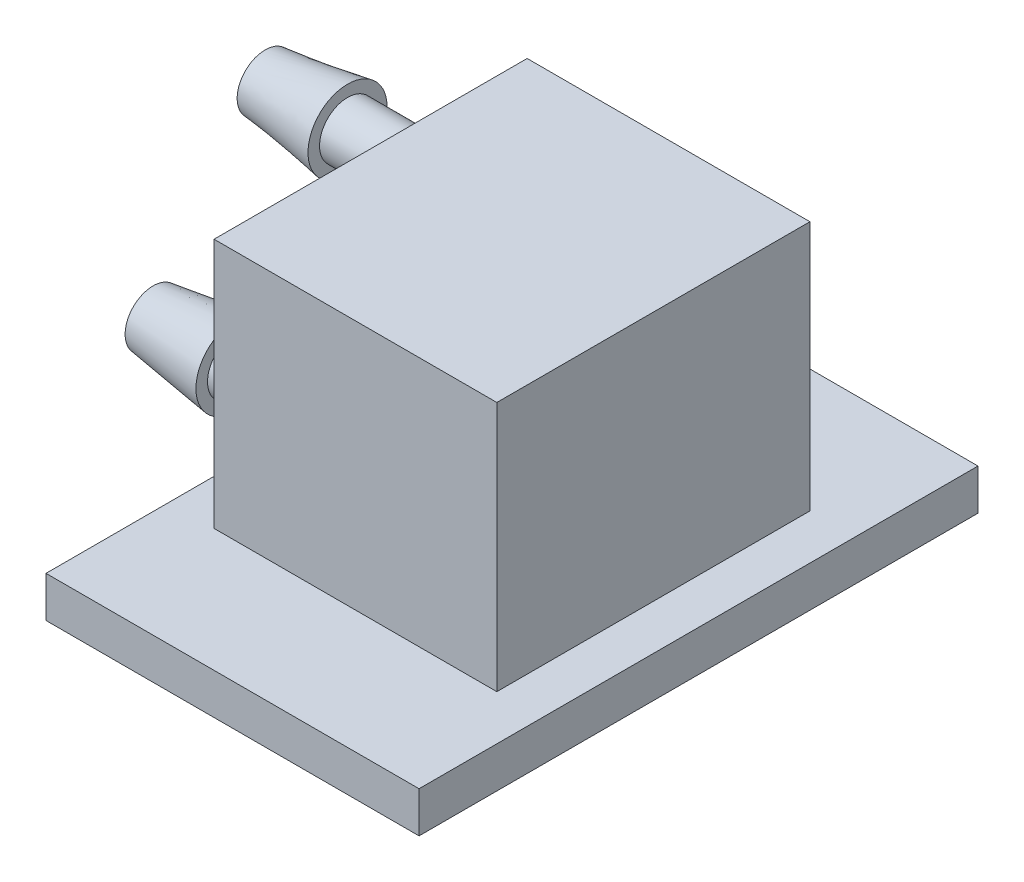
ISO-10303-21;
HEADER;
FILE_DESCRIPTION(('STEP AP214'),'2;1');
FILE_NAME('part.step','',(''),(''),'','','');
FILE_SCHEMA(('AUTOMOTIVE_DESIGN { 1 0 10303 214 1 1 1 1 }'));
ENDSEC;
DATA;
#1=APPLICATION_CONTEXT('core data for automotive mechanical design processes');
#2=APPLICATION_PROTOCOL_DEFINITION('international standard','automotive_design',2000,#1);
#3=PRODUCT_CONTEXT('',#1,'mechanical');
#4=PRODUCT('Part','Part','',(#3));
#5=PRODUCT_RELATED_PRODUCT_CATEGORY('part','',(#4));
#6=PRODUCT_DEFINITION_FORMATION('','',#4);
#7=PRODUCT_DEFINITION_CONTEXT('part definition',#1,'design');
#8=PRODUCT_DEFINITION('design','',#6,#7);
#9=PRODUCT_DEFINITION_SHAPE('','',#8);
#10=(LENGTH_UNIT() NAMED_UNIT(*) SI_UNIT(.MILLI.,.METRE.));
#11=(NAMED_UNIT(*) PLANE_ANGLE_UNIT() SI_UNIT($,.RADIAN.));
#12=(NAMED_UNIT(*) SI_UNIT($,.STERADIAN.) SOLID_ANGLE_UNIT());
#13=UNCERTAINTY_MEASURE_WITH_UNIT(LENGTH_MEASURE(1.E-05),#10,'distance_accuracy_value','');
#14=(GEOMETRIC_REPRESENTATION_CONTEXT(3) GLOBAL_UNCERTAINTY_ASSIGNED_CONTEXT((#13)) GLOBAL_UNIT_ASSIGNED_CONTEXT((#10,
#11,#12)) REPRESENTATION_CONTEXT('',''));
#15=CARTESIAN_POINT('',(0.,0.,0.));
#16=DIRECTION('',(0.,0.,1.));
#17=DIRECTION('',(1.,0.,0.));
#18=AXIS2_PLACEMENT_3D('',#15,#16,#17);
#19=CARTESIAN_POINT('',(0.,9.652,0.));
#20=DIRECTION('',(1.,0.,0.));
#21=DIRECTION('',(0.,0.,-1.));
#22=AXIS2_PLACEMENT_3D('',#19,#20,#21);
#23=PLANE('',#22);
#24=CARTESIAN_POINT('',(0.,7.6835,-8.1915));
#25=DIRECTION('',(1.,0.,0.));
#26=DIRECTION('',(0.,0.,-1.));
#27=AXIS2_PLACEMENT_3D('',#24,#25,#26);
#28=CIRCLE('',#27,1.0795);
#29=CARTESIAN_POINT('',(0.,7.6835,-9.271));
#30=VERTEX_POINT('',#29);
#31=EDGE_CURVE('E47',#30,#30,#28,.F.);
#32=ORIENTED_EDGE('',*,*,#31,.F.);
#33=EDGE_LOOP('',(#32));
#34=FACE_BOUND('',#33,.T.);
#35=DIRECTION('',(0.,0.,1.));
#36=VECTOR('',#35,1.);
#37=CARTESIAN_POINT('',(0.,0.,0.));
#38=LINE('',#37,#36);
#39=CARTESIAN_POINT('',(0.,0.,-12.065));
#40=VERTEX_POINT('',#39);
#41=CARTESIAN_POINT('',(0.,0.,0.));
#42=VERTEX_POINT('',#41);
#43=EDGE_CURVE('E225',#40,#42,#38,.T.);
#44=ORIENTED_EDGE('',*,*,#43,.T.);
#45=DIRECTION('',(0.,-1.,0.));
#46=VECTOR('',#45,1.);
#47=CARTESIAN_POINT('',(0.,9.652,0.));
#48=LINE('',#47,#46);
#49=CARTESIAN_POINT('',(0.,9.652,0.));
#50=VERTEX_POINT('',#49);
#51=EDGE_CURVE('E253',#50,#42,#48,.T.);
#52=ORIENTED_EDGE('',*,*,#51,.F.);
#53=DIRECTION('',(0.,0.,1.));
#54=VECTOR('',#53,1.);
#55=CARTESIAN_POINT('',(0.,9.652,0.));
#56=LINE('',#55,#54);
#57=CARTESIAN_POINT('',(0.,9.652,-12.065));
#58=VERTEX_POINT('',#57);
#59=EDGE_CURVE('E226',#58,#50,#56,.T.);
#60=ORIENTED_EDGE('',*,*,#59,.F.);
#61=DIRECTION('',(0.,-1.,0.));
#62=VECTOR('',#61,1.);
#63=CARTESIAN_POINT('',(0.,9.652,-12.065));
#64=LINE('',#63,#62);
#65=EDGE_CURVE('E234',#58,#40,#64,.T.);
#66=ORIENTED_EDGE('',*,*,#65,.T.);
#67=EDGE_LOOP('',(#44,#52,#60,#66));
#68=FACE_BOUND('',#67,.T.);
#69=CARTESIAN_POINT('',(0.,1.9685,-3.8735));
#70=DIRECTION('',(1.,0.,0.));
#71=DIRECTION('',(0.,0.,-1.));
#72=AXIS2_PLACEMENT_3D('',#69,#70,#71);
#73=CIRCLE('',#72,1.0795);
#74=CARTESIAN_POINT('',(0.,1.9685,-4.953));
#75=VERTEX_POINT('',#74);
#76=EDGE_CURVE('E12',#75,#75,#73,.F.);
#77=ORIENTED_EDGE('',*,*,#76,.F.);
#78=EDGE_LOOP('',(#77));
#79=FACE_BOUND('',#78,.T.);
#80=ADVANCED_FACE('F39',(#34,#68,#79),#23,.F.);
#81=CARTESIAN_POINT('',(0.,9.652,0.));
#82=DIRECTION('',(0.,0.,-1.));
#83=DIRECTION('',(-1.,0.,0.));
#84=AXIS2_PLACEMENT_3D('',#81,#82,#83);
#85=PLANE('',#84);
#86=DIRECTION('',(1.,0.,0.));
#87=VECTOR('',#86,1.);
#88=CARTESIAN_POINT('',(0.,0.,0.));
#89=LINE('',#88,#87);
#90=CARTESIAN_POINT('',(10.8966,0.,0.));
#91=VERTEX_POINT('',#90);
#92=EDGE_CURVE('E237',#42,#91,#89,.T.);
#93=ORIENTED_EDGE('',*,*,#92,.T.);
#94=DIRECTION('',(0.,-1.,0.));
#95=VECTOR('',#94,1.);
#96=CARTESIAN_POINT('',(10.8966,9.652,0.));
#97=LINE('',#96,#95);
#98=CARTESIAN_POINT('',(10.8966,9.652,0.));
#99=VERTEX_POINT('',#98);
#100=EDGE_CURVE('E250',#99,#91,#97,.T.);
#101=ORIENTED_EDGE('',*,*,#100,.F.);
#102=DIRECTION('',(1.,0.,0.));
#103=VECTOR('',#102,1.);
#104=CARTESIAN_POINT('',(0.,9.652,0.));
#105=LINE('',#104,#103);
#106=EDGE_CURVE('E228',#50,#99,#105,.T.);
#107=ORIENTED_EDGE('',*,*,#106,.F.);
#108=ORIENTED_EDGE('',*,*,#51,.T.);
#109=EDGE_LOOP('',(#93,#101,#107,#108));
#110=FACE_BOUND('',#109,.T.);
#111=ADVANCED_FACE('F262',(#110),#85,.F.);
#112=CARTESIAN_POINT('',(10.8966,9.652,0.));
#113=DIRECTION('',(-1.,0.,0.));
#114=DIRECTION('',(0.,0.,1.));
#115=AXIS2_PLACEMENT_3D('',#112,#113,#114);
#116=PLANE('',#115);
#117=DIRECTION('',(0.,0.,-1.));
#118=VECTOR('',#117,1.);
#119=CARTESIAN_POINT('',(10.8966,0.,0.));
#120=LINE('',#119,#118);
#121=CARTESIAN_POINT('',(10.8966,0.,-12.065));
#122=VERTEX_POINT('',#121);
#123=EDGE_CURVE('E240',#91,#122,#120,.T.);
#124=ORIENTED_EDGE('',*,*,#123,.T.);
#125=DIRECTION('',(0.,-1.,0.));
#126=VECTOR('',#125,1.);
#127=CARTESIAN_POINT('',(10.8966,9.652,-12.065));
#128=LINE('',#127,#126);
#129=CARTESIAN_POINT('',(10.8966,9.652,-12.065));
#130=VERTEX_POINT('',#129);
#131=EDGE_CURVE('E247',#130,#122,#128,.T.);
#132=ORIENTED_EDGE('',*,*,#131,.F.);
#133=DIRECTION('',(0.,0.,-1.));
#134=VECTOR('',#133,1.);
#135=CARTESIAN_POINT('',(10.8966,9.652,0.));
#136=LINE('',#135,#134);
#137=EDGE_CURVE('E231',#99,#130,#136,.T.);
#138=ORIENTED_EDGE('',*,*,#137,.F.);
#139=ORIENTED_EDGE('',*,*,#100,.T.);
#140=EDGE_LOOP('',(#124,#132,#138,#139));
#141=FACE_BOUND('',#140,.T.);
#142=ADVANCED_FACE('F398',(#141),#116,.F.);
#143=CARTESIAN_POINT('',(0.,9.652,-12.065));
#144=DIRECTION('',(0.,0.,1.));
#145=DIRECTION('',(1.,0.,0.));
#146=AXIS2_PLACEMENT_3D('',#143,#144,#145);
#147=PLANE('',#146);
#148=DIRECTION('',(-1.,0.,0.));
#149=VECTOR('',#148,1.);
#150=CARTESIAN_POINT('',(0.,0.,-12.065));
#151=LINE('',#150,#149);
#152=EDGE_CURVE('E229',#122,#40,#151,.T.);
#153=ORIENTED_EDGE('',*,*,#152,.T.);
#154=ORIENTED_EDGE('',*,*,#65,.F.);
#155=DIRECTION('',(-1.,0.,0.));
#156=VECTOR('',#155,1.);
#157=CARTESIAN_POINT('',(0.,9.652,-12.065));
#158=LINE('',#157,#156);
#159=EDGE_CURVE('E54',#130,#58,#158,.T.);
#160=ORIENTED_EDGE('',*,*,#159,.F.);
#161=ORIENTED_EDGE('',*,*,#131,.T.);
#162=EDGE_LOOP('',(#153,#154,#160,#161));
#163=FACE_BOUND('',#162,.T.);
#164=ADVANCED_FACE('F391',(#163),#147,.F.);
#165=CARTESIAN_POINT('',(0.,9.652,0.));
#166=DIRECTION('',(0.,-1.,0.));
#167=DIRECTION('',(0.,0.,-1.));
#168=AXIS2_PLACEMENT_3D('',#165,#166,#167);
#169=PLANE('',#168);
#170=ORIENTED_EDGE('',*,*,#59,.T.);
#171=ORIENTED_EDGE('',*,*,#106,.T.);
#172=ORIENTED_EDGE('',*,*,#137,.T.);
#173=ORIENTED_EDGE('',*,*,#159,.T.);
#174=EDGE_LOOP('',(#170,#171,#172,#173));
#175=FACE_BOUND('',#174,.T.);
#176=ADVANCED_FACE('F275',(#175),#169,.F.);
#177=CARTESIAN_POINT('',(-3.048,7.6835,-8.1915));
#178=DIRECTION('',(1.,0.,0.));
#179=DIRECTION('',(0.,0.,-1.));
#180=AXIS2_PLACEMENT_3D('',#177,#178,#179);
#181=CYLINDRICAL_SURFACE('',#180,1.0795);
#182=CARTESIAN_POINT('',(-3.048,7.6835,-8.1915));
#183=DIRECTION('',(-1.,0.,0.));
#184=DIRECTION('',(0.,0.,1.));
#185=AXIS2_PLACEMENT_3D('',#182,#183,#184);
#186=CIRCLE('',#185,1.0795);
#187=CARTESIAN_POINT('',(-3.048,7.6835,-9.271));
#188=VERTEX_POINT('',#187);
#189=EDGE_CURVE('E222',#188,#188,#186,.T.);
#190=CARTESIAN_POINT('',(-3.048,7.6835,-9.271));
#191=CARTESIAN_POINT('',(-3.01625,7.6835,-9.271));
#192=CARTESIAN_POINT('',(-2.9845,7.6835,-9.271));
#193=CARTESIAN_POINT('',(-2.921,7.6835,-9.271));
#194=CARTESIAN_POINT('',(-2.88925,7.6835,-9.271));
#195=CARTESIAN_POINT('',(-2.82575,7.6835,-9.271));
#196=CARTESIAN_POINT('',(-2.794,7.6835,-9.271));
#197=CARTESIAN_POINT('',(-2.7305,7.6835,-9.271));
#198=CARTESIAN_POINT('',(-2.69875,7.6835,-9.271));
#199=CARTESIAN_POINT('',(-2.63525,7.6835,-9.271));
#200=CARTESIAN_POINT('',(-2.6035,7.6835,-9.271));
#201=CARTESIAN_POINT('',(-2.54,7.6835,-9.271));
#202=CARTESIAN_POINT('',(-2.50825,7.6835,-9.271));
#203=CARTESIAN_POINT('',(-2.44475,7.6835,-9.271));
#204=CARTESIAN_POINT('',(-2.413,7.6835,-9.271));
#205=CARTESIAN_POINT('',(-2.3495,7.6835,-9.271));
#206=CARTESIAN_POINT('',(-2.31775,7.6835,-9.271));
#207=CARTESIAN_POINT('',(-2.25425,7.6835,-9.271));
#208=CARTESIAN_POINT('',(-2.2225,7.6835,-9.271));
#209=CARTESIAN_POINT('',(-2.159,7.6835,-9.271));
#210=CARTESIAN_POINT('',(-2.12725,7.6835,-9.271));
#211=CARTESIAN_POINT('',(-2.06375,7.6835,-9.271));
#212=CARTESIAN_POINT('',(-2.032,7.6835,-9.271));
#213=CARTESIAN_POINT('',(-1.9685,7.6835,-9.271));
#214=CARTESIAN_POINT('',(-1.93675,7.6835,-9.271));
#215=CARTESIAN_POINT('',(-1.87325,7.6835,-9.271));
#216=CARTESIAN_POINT('',(-1.8415,7.6835,-9.271));
#217=CARTESIAN_POINT('',(-1.778,7.6835,-9.271));
#218=CARTESIAN_POINT('',(-1.74625,7.6835,-9.271));
#219=CARTESIAN_POINT('',(-1.68275,7.6835,-9.271));
#220=CARTESIAN_POINT('',(-1.651,7.6835,-9.271));
#221=CARTESIAN_POINT('',(-1.5875,7.6835,-9.271));
#222=CARTESIAN_POINT('',(-1.55575,7.6835,-9.271));
#223=CARTESIAN_POINT('',(-1.49225,7.6835,-9.271));
#224=CARTESIAN_POINT('',(-1.4605,7.6835,-9.271));
#225=CARTESIAN_POINT('',(-1.397,7.6835,-9.271));
#226=CARTESIAN_POINT('',(-1.36525,7.6835,-9.271));
#227=CARTESIAN_POINT('',(-1.30175,7.6835,-9.271));
#228=CARTESIAN_POINT('',(-1.27,7.6835,-9.271));
#229=CARTESIAN_POINT('',(-1.2065,7.6835,-9.271));
#230=CARTESIAN_POINT('',(-1.17475,7.6835,-9.271));
#231=CARTESIAN_POINT('',(-1.11125,7.6835,-9.271));
#232=CARTESIAN_POINT('',(-1.0795,7.6835,-9.271));
#233=CARTESIAN_POINT('',(-1.016,7.6835,-9.271));
#234=CARTESIAN_POINT('',(-0.98425,7.6835,-9.271));
#235=CARTESIAN_POINT('',(-0.92075,7.6835,-9.271));
#236=CARTESIAN_POINT('',(-0.889,7.6835,-9.271));
#237=CARTESIAN_POINT('',(-0.8255,7.6835,-9.271));
#238=CARTESIAN_POINT('',(-0.79375,7.6835,-9.271));
#239=CARTESIAN_POINT('',(-0.73025,7.6835,-9.271));
#240=CARTESIAN_POINT('',(-0.6985,7.6835,-9.271));
#241=CARTESIAN_POINT('',(-0.635,7.6835,-9.271));
#242=CARTESIAN_POINT('',(-0.60325,7.6835,-9.271));
#243=CARTESIAN_POINT('',(-0.53975,7.6835,-9.271));
#244=CARTESIAN_POINT('',(-0.508,7.6835,-9.271));
#245=CARTESIAN_POINT('',(-0.4445,7.6835,-9.271));
#246=CARTESIAN_POINT('',(-0.41275,7.6835,-9.271));
#247=CARTESIAN_POINT('',(-0.34925,7.6835,-9.271));
#248=CARTESIAN_POINT('',(-0.3175,7.6835,-9.271));
#249=CARTESIAN_POINT('',(-0.254,7.6835,-9.271));
#250=CARTESIAN_POINT('',(-0.22225,7.6835,-9.271));
#251=CARTESIAN_POINT('',(-0.15875,7.6835,-9.271));
#252=CARTESIAN_POINT('',(-0.127,7.6835,-9.271));
#253=CARTESIAN_POINT('',(-0.0634999999999999,7.6835,-9.271));
#254=CARTESIAN_POINT('',(-0.03175,7.6835,-9.271));
#255=CARTESIAN_POINT('',(0.,7.6835,-9.271));
#256=B_SPLINE_CURVE_WITH_KNOTS('',3,(#190,#191,#192,#193,#194,#195,#196,#197,#198,#199,#200,
#201,#202,#203,#204,#205,#206,#207,#208,#209,#210,#211,#212,#213,#214,#215,#216,#217,#218,#219,
#220,#221,#222,#223,#224,#225,#226,#227,#228,#229,#230,#231,#232,#233,#234,#235,#236,#237,#238,
#239,#240,#241,#242,#243,#244,#245,#246,#247,#248,#249,#250,#251,#252,#253,#254,#255),
.UNSPECIFIED.,.F.,.F.,(4,2,2,2,2,2,2,2,2,2,2,2,2,2,2,2,2,2,2,2,2,2,2,2,2,2,2,2,2,2,2,2,4),(0.,
0.0952499999999998,0.1905,0.28575,0.381,0.47625,0.5715,0.66675,0.762,0.85725,0.9525,1.04775,
1.143,1.23825,1.3335,1.42875,1.524,1.61925,1.7145,1.80975,1.905,2.00025,2.0955,2.19075,2.286,
2.38125,2.4765,2.57175,2.667,2.76225,2.8575,2.95275,3.048),.UNSPECIFIED.);
#257=EDGE_CURVE('BSEAM258',#188,#30,#256,.T.);
#258=ORIENTED_EDGE('',*,*,#189,.F.);
#259=ORIENTED_EDGE('',*,*,#31,.T.);
#260=ORIENTED_EDGE('',*,*,#257,.T.);
#261=ORIENTED_EDGE('',*,*,#257,.F.);
#262=EDGE_LOOP('',(#258,#260,#259,#261));
#263=FACE_BOUND('',#262,.T.);
#264=ADVANCED_FACE('F258',(#263),#181,.T.);
#265=CARTESIAN_POINT('',(-3.048,1.9685,-3.8735));
#266=DIRECTION('',(1.,0.,0.));
#267=DIRECTION('',(0.,0.,-1.));
#268=AXIS2_PLACEMENT_3D('',#265,#266,#267);
#269=CYLINDRICAL_SURFACE('',#268,1.0795);
#270=CARTESIAN_POINT('',(-3.048,1.9685,-3.8735));
#271=DIRECTION('',(-1.,0.,0.));
#272=DIRECTION('',(0.,0.,1.));
#273=AXIS2_PLACEMENT_3D('',#270,#271,#272);
#274=CIRCLE('',#273,1.0795);
#275=CARTESIAN_POINT('',(-3.048,1.9685,-4.953));
#276=VERTEX_POINT('',#275);
#277=EDGE_CURVE('E219',#276,#276,#274,.T.);
#278=CARTESIAN_POINT('',(-3.048,1.9685,-4.953));
#279=CARTESIAN_POINT('',(-3.01625,1.9685,-4.953));
#280=CARTESIAN_POINT('',(-2.9845,1.9685,-4.953));
#281=CARTESIAN_POINT('',(-2.921,1.9685,-4.953));
#282=CARTESIAN_POINT('',(-2.88925,1.9685,-4.953));
#283=CARTESIAN_POINT('',(-2.82575,1.9685,-4.953));
#284=CARTESIAN_POINT('',(-2.794,1.9685,-4.953));
#285=CARTESIAN_POINT('',(-2.7305,1.9685,-4.953));
#286=CARTESIAN_POINT('',(-2.69875,1.9685,-4.953));
#287=CARTESIAN_POINT('',(-2.63525,1.9685,-4.953));
#288=CARTESIAN_POINT('',(-2.6035,1.9685,-4.953));
#289=CARTESIAN_POINT('',(-2.54,1.9685,-4.953));
#290=CARTESIAN_POINT('',(-2.50825,1.9685,-4.953));
#291=CARTESIAN_POINT('',(-2.44475,1.9685,-4.953));
#292=CARTESIAN_POINT('',(-2.413,1.9685,-4.953));
#293=CARTESIAN_POINT('',(-2.3495,1.9685,-4.953));
#294=CARTESIAN_POINT('',(-2.31775,1.9685,-4.953));
#295=CARTESIAN_POINT('',(-2.25425,1.9685,-4.953));
#296=CARTESIAN_POINT('',(-2.2225,1.9685,-4.953));
#297=CARTESIAN_POINT('',(-2.159,1.9685,-4.953));
#298=CARTESIAN_POINT('',(-2.12725,1.9685,-4.953));
#299=CARTESIAN_POINT('',(-2.06375,1.9685,-4.953));
#300=CARTESIAN_POINT('',(-2.032,1.9685,-4.953));
#301=CARTESIAN_POINT('',(-1.9685,1.9685,-4.953));
#302=CARTESIAN_POINT('',(-1.93675,1.9685,-4.953));
#303=CARTESIAN_POINT('',(-1.87325,1.9685,-4.953));
#304=CARTESIAN_POINT('',(-1.8415,1.9685,-4.953));
#305=CARTESIAN_POINT('',(-1.778,1.9685,-4.953));
#306=CARTESIAN_POINT('',(-1.74625,1.9685,-4.953));
#307=CARTESIAN_POINT('',(-1.68275,1.9685,-4.953));
#308=CARTESIAN_POINT('',(-1.651,1.9685,-4.953));
#309=CARTESIAN_POINT('',(-1.5875,1.9685,-4.953));
#310=CARTESIAN_POINT('',(-1.55575,1.9685,-4.953));
#311=CARTESIAN_POINT('',(-1.49225,1.9685,-4.953));
#312=CARTESIAN_POINT('',(-1.4605,1.9685,-4.953));
#313=CARTESIAN_POINT('',(-1.397,1.9685,-4.953));
#314=CARTESIAN_POINT('',(-1.36525,1.9685,-4.953));
#315=CARTESIAN_POINT('',(-1.30175,1.9685,-4.953));
#316=CARTESIAN_POINT('',(-1.27,1.9685,-4.953));
#317=CARTESIAN_POINT('',(-1.2065,1.9685,-4.953));
#318=CARTESIAN_POINT('',(-1.17475,1.9685,-4.953));
#319=CARTESIAN_POINT('',(-1.11125,1.9685,-4.953));
#320=CARTESIAN_POINT('',(-1.0795,1.9685,-4.953));
#321=CARTESIAN_POINT('',(-1.016,1.9685,-4.953));
#322=CARTESIAN_POINT('',(-0.98425,1.9685,-4.953));
#323=CARTESIAN_POINT('',(-0.92075,1.9685,-4.953));
#324=CARTESIAN_POINT('',(-0.889,1.9685,-4.953));
#325=CARTESIAN_POINT('',(-0.8255,1.9685,-4.953));
#326=CARTESIAN_POINT('',(-0.79375,1.9685,-4.953));
#327=CARTESIAN_POINT('',(-0.73025,1.9685,-4.953));
#328=CARTESIAN_POINT('',(-0.6985,1.9685,-4.953));
#329=CARTESIAN_POINT('',(-0.635,1.9685,-4.953));
#330=CARTESIAN_POINT('',(-0.60325,1.9685,-4.953));
#331=CARTESIAN_POINT('',(-0.53975,1.9685,-4.953));
#332=CARTESIAN_POINT('',(-0.508,1.9685,-4.953));
#333=CARTESIAN_POINT('',(-0.4445,1.9685,-4.953));
#334=CARTESIAN_POINT('',(-0.41275,1.9685,-4.953));
#335=CARTESIAN_POINT('',(-0.34925,1.9685,-4.953));
#336=CARTESIAN_POINT('',(-0.3175,1.9685,-4.953));
#337=CARTESIAN_POINT('',(-0.254,1.9685,-4.953));
#338=CARTESIAN_POINT('',(-0.22225,1.9685,-4.953));
#339=CARTESIAN_POINT('',(-0.15875,1.9685,-4.953));
#340=CARTESIAN_POINT('',(-0.127,1.9685,-4.953));
#341=CARTESIAN_POINT('',(-0.0634999999999999,1.9685,-4.953));
#342=CARTESIAN_POINT('',(-0.03175,1.9685,-4.953));
#343=CARTESIAN_POINT('',(0.,1.9685,-4.953));
#344=B_SPLINE_CURVE_WITH_KNOTS('',3,(#278,#279,#280,#281,#282,#283,#284,#285,#286,#287,#288,
#289,#290,#291,#292,#293,#294,#295,#296,#297,#298,#299,#300,#301,#302,#303,#304,#305,#306,#307,
#308,#309,#310,#311,#312,#313,#314,#315,#316,#317,#318,#319,#320,#321,#322,#323,#324,#325,#326,
#327,#328,#329,#330,#331,#332,#333,#334,#335,#336,#337,#338,#339,#340,#341,#342,#343),
.UNSPECIFIED.,.F.,.F.,(4,2,2,2,2,2,2,2,2,2,2,2,2,2,2,2,2,2,2,2,2,2,2,2,2,2,2,2,2,2,2,2,4),(0.,
0.0952499999999998,0.1905,0.28575,0.381,0.47625,0.5715,0.66675,0.762,0.85725,0.9525,1.04775,
1.143,1.23825,1.3335,1.42875,1.524,1.61925,1.7145,1.80975,1.905,2.00025,2.0955,2.19075,2.286,
2.38125,2.4765,2.57175,2.667,2.76225,2.8575,2.95275,3.048),.UNSPECIFIED.);
#345=EDGE_CURVE('BSEAM205',#276,#75,#344,.T.);
#346=ORIENTED_EDGE('',*,*,#277,.F.);
#347=ORIENTED_EDGE('',*,*,#76,.T.);
#348=ORIENTED_EDGE('',*,*,#345,.T.);
#349=ORIENTED_EDGE('',*,*,#345,.F.);
#350=EDGE_LOOP('',(#346,#348,#347,#349));
#351=FACE_BOUND('',#350,.T.);
#352=ADVANCED_FACE('F205',(#351),#269,.T.);
#353=CARTESIAN_POINT('',(-3.048,7.6835,-8.1915));
#354=DIRECTION('',(-1.,0.,0.));
#355=DIRECTION('',(0.,0.,1.));
#356=AXIS2_PLACEMENT_3D('',#353,#354,#355);
#357=PLANE('',#356);
#358=CARTESIAN_POINT('',(-3.048,7.6835,-8.1915));
#359=DIRECTION('',(-1.,0.,0.));
#360=DIRECTION('',(0.,0.,1.));
#361=AXIS2_PLACEMENT_3D('',#358,#359,#360);
#362=CIRCLE('',#361,1.524);
#363=CARTESIAN_POINT('',(-3.048,9.15323254198039,-7.78843393216016));
#364=VERTEX_POINT('',#363);
#365=EDGE_CURVE('E181',#364,#364,#362,.T.);
#366=ORIENTED_EDGE('',*,*,#365,.F.);
#367=EDGE_LOOP('',(#366));
#368=FACE_BOUND('',#367,.T.);
#369=ORIENTED_EDGE('',*,*,#189,.T.);
#370=EDGE_LOOP('',(#369));
#371=FACE_BOUND('',#370,.T.);
#372=ADVANCED_FACE('F160',(#368,#371),#357,.F.);
#373=CARTESIAN_POINT('',(-6.223,7.6835,-8.1915));
#374=DIRECTION('',(-1.,0.,0.));
#375=DIRECTION('',(0.,0.,1.));
#376=AXIS2_PLACEMENT_3D('',#373,#374,#375);
#377=PLANE('',#376);
#378=CARTESIAN_POINT('',(-6.223,7.6835,-8.1915));
#379=DIRECTION('',(-1.,0.,0.));
#380=DIRECTION('',(0.,0.,1.));
#381=AXIS2_PLACEMENT_3D('',#378,#379,#380);
#382=CIRCLE('',#381,1.0795);
#383=CARTESIAN_POINT('',(-6.223,8.48238809349448,-7.46548480451663));
#384=VERTEX_POINT('',#383);
#385=EDGE_CURVE('E177',#384,#384,#382,.T.);
#386=ORIENTED_EDGE('',*,*,#385,.T.);
#387=EDGE_LOOP('',(#386));
#388=FACE_BOUND('',#387,.T.);
#389=ADVANCED_FACE('F194',(#388),#377,.T.);
#390=CARTESIAN_POINT('',(-3.048,9.15323254198039,-7.78843393216016));
#391=CARTESIAN_POINT('',(-6.223,8.48238809349448,-7.46548480451663));
#392=CARTESIAN_POINT('',(-3.048,9.95936467766007,-10.7278990161209));
#393=CARTESIAN_POINT('',(-6.223,9.93441848446122,-9.0632609915056));
#394=CARTESIAN_POINT('',(-3.048,7.0198995936993,-11.5340311518006));
#395=CARTESIAN_POINT('',(-6.223,8.33664229747225,-10.5152913824723));
#396=CARTESIAN_POINT('',(-3.048,6.21376745801961,-8.59456606783984));
#397=CARTESIAN_POINT('',(-6.223,6.88461190650552,-8.91751519548336));
#398=CARTESIAN_POINT('',(-3.048,5.40763532233993,-5.65510098387907));
#399=CARTESIAN_POINT('',(-6.223,5.43258151553878,-7.3197390084944));
#400=CARTESIAN_POINT('',(-3.048,8.3471004063007,-4.84896884819938));
#401=CARTESIAN_POINT('',(-6.223,7.03035770252775,-5.86770861752767));
#402=CARTESIAN_POINT('',(-3.048,9.15323254198039,-7.78843393216016));
#403=CARTESIAN_POINT('',(-6.223,8.48238809349448,-7.46548480451663));
#404=(BOUNDED_SURFACE() B_SPLINE_SURFACE(3,1,((#390,#391),(#392,#393),(#394,#395),(#396,#397),
(#398,#399),(#400,#401),(#402,#403)),.UNSPECIFIED.,.T.,.F.,.F.) B_SPLINE_SURFACE_WITH_KNOTS((4,
3,4),(2,2),(0.,0.5,1.),(0.,1.),
.UNSPECIFIED.) GEOMETRIC_REPRESENTATION_ITEM() RATIONAL_B_SPLINE_SURFACE(((1.,1.),
(0.333333333333333,0.333333333333333),(0.333333333333333,0.333333333333333),(1.,1.),
(0.333333333333333,0.333333333333334),(0.333333333333333,0.333333333333334),(1.,1.))) REPRESENTATION_ITEM('') SURFACE());
#405=CARTESIAN_POINT('',(-3.048,9.15323254198039,-7.78843393216016));
#406=CARTESIAN_POINT('',(-3.08107291666667,9.14624457897533,-7.7850698787472));
#407=CARTESIAN_POINT('',(-3.11414583333333,9.13925661597026,-7.78170582533425));
#408=CARTESIAN_POINT('',(-3.18029166666667,9.12528068996014,-7.77497771850834));
#409=CARTESIAN_POINT('',(-3.21336458333333,9.11829272695508,-7.77161366509539));
#410=CARTESIAN_POINT('',(-3.27951041666667,9.10431680094495,-7.76488555826948));
#411=CARTESIAN_POINT('',(-3.31258333333333,9.09732883793989,-7.76152150485653));
#412=CARTESIAN_POINT('',(-3.37872916666667,9.08335291192977,-7.75479339803062));
#413=CARTESIAN_POINT('',(-3.41180208333333,9.07636494892471,-7.75142934461767));
#414=CARTESIAN_POINT('',(-3.47794791666667,9.06238902291459,-7.74470123779176));
#415=CARTESIAN_POINT('',(-3.51102083333333,9.05540105990952,-7.74133718437881));
#416=CARTESIAN_POINT('',(-3.57716666666667,9.0414251338994,-7.7346090775529));
#417=CARTESIAN_POINT('',(-3.61023958333333,9.03443717089434,-7.73124502413995));
#418=CARTESIAN_POINT('',(-3.67638541666667,9.02046124488422,-7.72451691731404));
#419=CARTESIAN_POINT('',(-3.70945833333333,9.01347328187915,-7.72115286390109));
#420=CARTESIAN_POINT('',(-3.77560416666667,8.99949735586903,-7.71442475707518));
#421=CARTESIAN_POINT('',(-3.80867708333333,8.99250939286397,-7.71106070366223));
#422=CARTESIAN_POINT('',(-3.87482291666667,8.97853346685385,-7.70433259683632));
#423=CARTESIAN_POINT('',(-3.90789583333333,8.97154550384879,-7.70096854342337));
#424=CARTESIAN_POINT('',(-3.97404166666667,8.95756957783867,-7.69424043659746));
#425=CARTESIAN_POINT('',(-4.00711458333333,8.9505816148336,-7.69087638318451));
#426=CARTESIAN_POINT('',(-4.07326041666667,8.93660568882348,-7.6841482763586));
#427=CARTESIAN_POINT('',(-4.10633333333333,8.92961772581842,-7.68078422294565));
#428=CARTESIAN_POINT('',(-4.17247916666667,8.9156417998083,-7.67405611611974));
#429=CARTESIAN_POINT('',(-4.20555208333333,8.90865383680323,-7.67069206270679));
#430=CARTESIAN_POINT('',(-4.27169791666667,8.89467791079311,-7.66396395588088));
#431=CARTESIAN_POINT('',(-4.30477083333333,8.88768994778805,-7.66059990246793));
#432=CARTESIAN_POINT('',(-4.37091666666667,8.87371402177793,-7.65387179564202));
#433=CARTESIAN_POINT('',(-4.40398958333333,8.86672605877286,-7.65050774222907));
#434=CARTESIAN_POINT('',(-4.47013541666667,8.85275013276274,-7.64377963540316));
#435=CARTESIAN_POINT('',(-4.50320833333333,8.84576216975768,-7.64041558199021));
#436=CARTESIAN_POINT('',(-4.56935416666667,8.83178624374756,-7.6336874751643));
#437=CARTESIAN_POINT('',(-4.60242708333333,8.8247982807425,-7.63032342175135));
#438=CARTESIAN_POINT('',(-4.66857291666667,8.81082235473237,-7.62359531492544));
#439=CARTESIAN_POINT('',(-4.70164583333333,8.80383439172731,-7.62023126151249));
#440=CARTESIAN_POINT('',(-4.76779166666667,8.78985846571719,-7.61350315468658));
#441=CARTESIAN_POINT('',(-4.80086458333333,8.78287050271213,-7.61013910127363));
#442=CARTESIAN_POINT('',(-4.86701041666667,8.768894576702,-7.60341099444772));
#443=CARTESIAN_POINT('',(-4.90008333333333,8.76190661369694,-7.60004694103477));
#444=CARTESIAN_POINT('',(-4.96622916666667,8.74793068768682,-7.59331883420886));
#445=CARTESIAN_POINT('',(-4.99930208333333,8.74094272468176,-7.58995478079591));
#446=CARTESIAN_POINT('',(-5.06544791666667,8.72696679867163,-7.58322667397));
#447=CARTESIAN_POINT('',(-5.09852083333333,8.71997883566657,-7.57986262055705));
#448=CARTESIAN_POINT('',(-5.16466666666667,8.70600290965645,-7.57313451373114));
#449=CARTESIAN_POINT('',(-5.19773958333333,8.69901494665139,-7.56977046031819));
#450=CARTESIAN_POINT('',(-5.26388541666667,8.68503902064127,-7.56304235349228));
#451=CARTESIAN_POINT('',(-5.29695833333333,8.6780510576362,-7.55967830007933));
#452=CARTESIAN_POINT('',(-5.36310416666667,8.66407513162608,-7.55295019325342));
#453=CARTESIAN_POINT('',(-5.39617708333333,8.65708716862102,-7.54958613984047));
#454=CARTESIAN_POINT('',(-5.46232291666667,8.6431112426109,-7.54285803301456));
#455=CARTESIAN_POINT('',(-5.49539583333333,8.63612327960583,-7.53949397960161));
#456=CARTESIAN_POINT('',(-5.56154166666667,8.62214735359571,-7.5327658727757));
#457=CARTESIAN_POINT('',(-5.59461458333333,8.61515939059065,-7.52940181936275));
#458=CARTESIAN_POINT('',(-5.66076041666667,8.60118346458053,-7.52267371253684));
#459=CARTESIAN_POINT('',(-5.69383333333333,8.59419550157547,-7.51930965912389));
#460=CARTESIAN_POINT('',(-5.75997916666667,8.58021957556534,-7.51258155229798));
#461=CARTESIAN_POINT('',(-5.79305208333333,8.57323161256028,-7.50921749888503));
#462=CARTESIAN_POINT('',(-5.85919791666667,8.55925568655016,-7.50248939205912));
#463=CARTESIAN_POINT('',(-5.89227083333333,8.5522677235451,-7.49912533864617));
#464=CARTESIAN_POINT('',(-5.95841666666667,8.53829179753498,-7.49239723182026));
#465=CARTESIAN_POINT('',(-5.99148958333333,8.53130383452991,-7.48903317840731));
#466=CARTESIAN_POINT('',(-6.05763541666667,8.51732790851979,-7.4823050715814));
#467=CARTESIAN_POINT('',(-6.09070833333333,8.51033994551473,-7.47894101816845));
#468=CARTESIAN_POINT('',(-6.15685416666667,8.49636401950461,-7.47221291134254));
#469=CARTESIAN_POINT('',(-6.18992708333333,8.48937605649954,-7.46884885792959));
#470=CARTESIAN_POINT('',(-6.223,8.48238809349448,-7.46548480451663));
#471=B_SPLINE_CURVE_WITH_KNOTS('',3,(#405,#406,#407,#408,#409,#410,#411,#412,#413,#414,#415,
#416,#417,#418,#419,#420,#421,#422,#423,#424,#425,#426,#427,#428,#429,#430,#431,#432,#433,#434,
#435,#436,#437,#438,#439,#440,#441,#442,#443,#444,#445,#446,#447,#448,#449,#450,#451,#452,#453,
#454,#455,#456,#457,#458,#459,#460,#461,#462,#463,#464,#465,#466,#467,#468,#469,#470),
.UNSPECIFIED.,.F.,.F.,(4,2,2,2,2,2,2,2,2,2,2,2,2,2,2,2,2,2,2,2,2,2,2,2,2,2,2,2,2,2,2,2,4),(0.,
0.101910238408563,0.203820476817128,0.305730715225691,0.407640953634255,0.509551192042818,
0.611461430451382,0.713371668859946,0.81528190726851,0.917192145677074,1.01910238408564,
1.1210126224942,1.22292286090276,1.32483309931133,1.42674333771989,1.52865357612846,
1.63056381453702,1.73247405294558,1.83438429135415,1.93629452976271,2.03820476817127,
2.14011500657984,2.2420252449884,2.34393548339696,2.44584572180553,2.54775596021409,
2.64966619862266,2.75157643703122,2.85348667543978,2.95539691384835,3.05730715225691,
3.15921739066548,3.26112762907404),.UNSPECIFIED.);
#472=EDGE_CURVE('BSEAM183',#364,#384,#471,.T.);
#473=ORIENTED_EDGE('',*,*,#365,.T.);
#474=ORIENTED_EDGE('',*,*,#385,.F.);
#475=ORIENTED_EDGE('',*,*,#472,.T.);
#476=ORIENTED_EDGE('',*,*,#472,.F.);
#477=EDGE_LOOP('',(#473,#475,#474,#476));
#478=FACE_BOUND('',#477,.T.);
#479=ADVANCED_FACE('F183',(#478),#404,.T.);
#480=CARTESIAN_POINT('',(-3.048,1.9685,-3.8735));
#481=DIRECTION('',(-1.,0.,0.));
#482=DIRECTION('',(0.,0.,1.));
#483=AXIS2_PLACEMENT_3D('',#480,#481,#482);
#484=PLANE('',#483);
#485=CARTESIAN_POINT('',(-3.048,1.9685,-3.8735));
#486=DIRECTION('',(-1.,0.,0.));
#487=DIRECTION('',(0.,0.,1.));
#488=AXIS2_PLACEMENT_3D('',#485,#486,#487);
#489=CIRCLE('',#488,1.524);
#490=CARTESIAN_POINT('',(-3.048,1.9685,-2.3495));
#491=VERTEX_POINT('',#490);
#492=EDGE_CURVE('E127',#491,#491,#489,.T.);
#493=ORIENTED_EDGE('',*,*,#492,.F.);
#494=EDGE_LOOP('',(#493));
#495=FACE_BOUND('',#494,.T.);
#496=ORIENTED_EDGE('',*,*,#277,.T.);
#497=EDGE_LOOP('',(#496));
#498=FACE_BOUND('',#497,.T.);
#499=ADVANCED_FACE('F154',(#495,#498),#484,.F.);
#500=CARTESIAN_POINT('',(-6.223,1.9685,-3.8735));
#501=DIRECTION('',(-1.,0.,0.));
#502=DIRECTION('',(0.,0.,1.));
#503=AXIS2_PLACEMENT_3D('',#500,#501,#502);
#504=PLANE('',#503);
#505=CARTESIAN_POINT('',(-6.223,1.9685,-3.8735));
#506=DIRECTION('',(-1.,0.,0.));
#507=DIRECTION('',(0.,0.,1.));
#508=AXIS2_PLACEMENT_3D('',#505,#506,#507);
#509=CIRCLE('',#508,1.0795);
#510=CARTESIAN_POINT('',(-6.223,1.9685,-2.794));
#511=VERTEX_POINT('',#510);
#512=EDGE_CURVE('E124',#511,#511,#509,.T.);
#513=ORIENTED_EDGE('',*,*,#512,.T.);
#514=EDGE_LOOP('',(#513));
#515=FACE_BOUND('',#514,.T.);
#516=ADVANCED_FACE('F152',(#515),#504,.T.);
#517=CARTESIAN_POINT('',(-6.223,1.9685,-3.8735));
#518=DIRECTION('',(1.,0.,0.));
#519=DIRECTION('',(0.,0.,-1.));
#520=AXIS2_PLACEMENT_3D('',#517,#518,#519);
#521=CONICAL_SURFACE('',#520,1.0795,0.139095941482071);
#522=ORIENTED_EDGE('',*,*,#492,.T.);
#523=EDGE_LOOP('',(#522));
#524=FACE_BOUND('',#523,.T.);
#525=ORIENTED_EDGE('',*,*,#512,.F.);
#526=EDGE_LOOP('',(#525));
#527=FACE_BOUND('',#526,.T.);
#528=ADVANCED_FACE('F141',(#524,#527),#521,.T.);
#529=CARTESIAN_POINT('',(0.,0.,0.));
#530=DIRECTION('',(0.,1.,0.));
#531=DIRECTION('',(0.,0.,1.));
#532=AXIS2_PLACEMENT_3D('',#529,#530,#531);
#533=PLANE('',#532);
#534=DIRECTION('',(0.,0.,1.));
#535=VECTOR('',#534,1.);
#536=CARTESIAN_POINT('',(12.6365,0.,4.7371));
#537=LINE('',#536,#535);
#538=CARTESIAN_POINT('',(12.6365,0.,-16.8021));
#539=VERTEX_POINT('',#538);
#540=CARTESIAN_POINT('',(12.6365,0.,4.7371));
#541=VERTEX_POINT('',#540);
#542=EDGE_CURVE('E123',#539,#541,#537,.T.);
#543=ORIENTED_EDGE('',*,*,#542,.F.);
#544=DIRECTION('',(1.,0.,0.));
#545=VECTOR('',#544,1.);
#546=CARTESIAN_POINT('',(12.6365,0.,-16.8021));
#547=LINE('',#546,#545);
#548=CARTESIAN_POINT('',(-1.7399,0.,-16.8021));
#549=VERTEX_POINT('',#548);
#550=EDGE_CURVE('E119',#549,#539,#547,.T.);
#551=ORIENTED_EDGE('',*,*,#550,.F.);
#552=DIRECTION('',(0.,0.,-1.));
#553=VECTOR('',#552,1.);
#554=CARTESIAN_POINT('',(-1.7399,0.,4.7371));
#555=LINE('',#554,#553);
#556=CARTESIAN_POINT('',(-1.7399,0.,4.7371));
#557=VERTEX_POINT('',#556);
#558=EDGE_CURVE('E433',#557,#549,#555,.T.);
#559=ORIENTED_EDGE('',*,*,#558,.F.);
#560=DIRECTION('',(-1.,0.,0.));
#561=VECTOR('',#560,1.);
#562=CARTESIAN_POINT('',(12.6365,0.,4.7371));
#563=LINE('',#562,#561);
#564=EDGE_CURVE('E436',#541,#557,#563,.T.);
#565=ORIENTED_EDGE('',*,*,#564,.F.);
#566=EDGE_LOOP('',(#543,#551,#559,#565));
#567=FACE_BOUND('',#566,.T.);
#568=ORIENTED_EDGE('',*,*,#43,.F.);
#569=ORIENTED_EDGE('',*,*,#152,.F.);
#570=ORIENTED_EDGE('',*,*,#123,.F.);
#571=ORIENTED_EDGE('',*,*,#92,.F.);
#572=EDGE_LOOP('',(#568,#569,#570,#571));
#573=FACE_BOUND('',#572,.T.);
#574=ADVANCED_FACE('F151',(#567,#573),#533,.T.);
#575=CARTESIAN_POINT('',(12.6365,-1.5748,4.7371));
#576=DIRECTION('',(-1.,0.,0.));
#577=DIRECTION('',(0.,0.,1.));
#578=AXIS2_PLACEMENT_3D('',#575,#576,#577);
#579=PLANE('',#578);
#580=ORIENTED_EDGE('',*,*,#542,.T.);
#581=DIRECTION('',(0.,1.,0.));
#582=VECTOR('',#581,1.);
#583=CARTESIAN_POINT('',(12.6365,-1.5748,4.7371));
#584=LINE('',#583,#582);
#585=CARTESIAN_POINT('',(12.6365,-1.5748,4.7371));
#586=VERTEX_POINT('',#585);
#587=EDGE_CURVE('E103',#586,#541,#584,.T.);
#588=ORIENTED_EDGE('',*,*,#587,.F.);
#589=DIRECTION('',(0.,0.,1.));
#590=VECTOR('',#589,1.);
#591=CARTESIAN_POINT('',(12.6365,-1.5748,4.7371));
#592=LINE('',#591,#590);
#593=CARTESIAN_POINT('',(12.6365,-1.5748,-16.8021));
#594=VERTEX_POINT('',#593);
#595=EDGE_CURVE('E110',#594,#586,#592,.T.);
#596=ORIENTED_EDGE('',*,*,#595,.F.);
#597=DIRECTION('',(0.,1.,0.));
#598=VECTOR('',#597,1.);
#599=CARTESIAN_POINT('',(12.6365,-1.5748,-16.8021));
#600=LINE('',#599,#598);
#601=EDGE_CURVE('E430',#594,#539,#600,.T.);
#602=ORIENTED_EDGE('',*,*,#601,.T.);
#603=EDGE_LOOP('',(#580,#588,#596,#602));
#604=FACE_BOUND('',#603,.T.);
#605=ADVANCED_FACE('F121',(#604),#579,.F.);
#606=CARTESIAN_POINT('',(12.6365,-1.5748,4.7371));
#607=DIRECTION('',(0.,0.,-1.));
#608=DIRECTION('',(-1.,0.,0.));
#609=AXIS2_PLACEMENT_3D('',#606,#607,#608);
#610=PLANE('',#609);
#611=ORIENTED_EDGE('',*,*,#564,.T.);
#612=DIRECTION('',(0.,1.,0.));
#613=VECTOR('',#612,1.);
#614=CARTESIAN_POINT('',(-1.7399,-1.5748,4.7371));
#615=LINE('',#614,#613);
#616=CARTESIAN_POINT('',(-1.7399,-1.5748,4.7371));
#617=VERTEX_POINT('',#616);
#618=EDGE_CURVE('E106',#617,#557,#615,.T.);
#619=ORIENTED_EDGE('',*,*,#618,.F.);
#620=DIRECTION('',(-1.,0.,0.));
#621=VECTOR('',#620,1.);
#622=CARTESIAN_POINT('',(12.6365,-1.5748,4.7371));
#623=LINE('',#622,#621);
#624=EDGE_CURVE('E99',#586,#617,#623,.T.);
#625=ORIENTED_EDGE('',*,*,#624,.F.);
#626=ORIENTED_EDGE('',*,*,#587,.T.);
#627=EDGE_LOOP('',(#611,#619,#625,#626));
#628=FACE_BOUND('',#627,.T.);
#629=ADVANCED_FACE('F101',(#628),#610,.F.);
#630=CARTESIAN_POINT('',(-1.7399,-1.5748,4.7371));
#631=DIRECTION('',(1.,0.,0.));
#632=DIRECTION('',(0.,0.,-1.));
#633=AXIS2_PLACEMENT_3D('',#630,#631,#632);
#634=PLANE('',#633);
#635=ORIENTED_EDGE('',*,*,#558,.T.);
#636=DIRECTION('',(0.,1.,0.));
#637=VECTOR('',#636,1.);
#638=CARTESIAN_POINT('',(-1.7399,-1.5748,-16.8021));
#639=LINE('',#638,#637);
#640=CARTESIAN_POINT('',(-1.7399,-1.5748,-16.8021));
#641=VERTEX_POINT('',#640);
#642=EDGE_CURVE('E129',#641,#549,#639,.T.);
#643=ORIENTED_EDGE('',*,*,#642,.F.);
#644=DIRECTION('',(0.,0.,-1.));
#645=VECTOR('',#644,1.);
#646=CARTESIAN_POINT('',(-1.7399,-1.5748,4.7371));
#647=LINE('',#646,#645);
#648=EDGE_CURVE('E109',#617,#641,#647,.T.);
#649=ORIENTED_EDGE('',*,*,#648,.F.);
#650=ORIENTED_EDGE('',*,*,#618,.T.);
#651=EDGE_LOOP('',(#635,#643,#649,#650));
#652=FACE_BOUND('',#651,.T.);
#653=ADVANCED_FACE('F315',(#652),#634,.F.);
#654=CARTESIAN_POINT('',(12.6365,-1.5748,-16.8021));
#655=DIRECTION('',(0.,0.,1.));
#656=DIRECTION('',(1.,0.,0.));
#657=AXIS2_PLACEMENT_3D('',#654,#655,#656);
#658=PLANE('',#657);
#659=ORIENTED_EDGE('',*,*,#550,.T.);
#660=ORIENTED_EDGE('',*,*,#601,.F.);
#661=DIRECTION('',(1.,0.,0.));
#662=VECTOR('',#661,1.);
#663=CARTESIAN_POINT('',(12.6365,-1.5748,-16.8021));
#664=LINE('',#663,#662);
#665=EDGE_CURVE('E115',#641,#594,#664,.T.);
#666=ORIENTED_EDGE('',*,*,#665,.F.);
#667=ORIENTED_EDGE('',*,*,#642,.T.);
#668=EDGE_LOOP('',(#659,#660,#666,#667));
#669=FACE_BOUND('',#668,.T.);
#670=ADVANCED_FACE('F322',(#669),#658,.F.);
#671=CARTESIAN_POINT('',(0.,-1.5748,0.));
#672=DIRECTION('',(0.,1.,0.));
#673=DIRECTION('',(0.,0.,1.));
#674=AXIS2_PLACEMENT_3D('',#671,#672,#673);
#675=PLANE('',#674);
#676=ORIENTED_EDGE('',*,*,#595,.T.);
#677=ORIENTED_EDGE('',*,*,#624,.T.);
#678=ORIENTED_EDGE('',*,*,#648,.T.);
#679=ORIENTED_EDGE('',*,*,#665,.T.);
#680=EDGE_LOOP('',(#676,#677,#678,#679));
#681=FACE_BOUND('',#680,.T.);
#682=ADVANCED_FACE('F113',(#681),#675,.F.);
#683=CLOSED_SHELL('',(#80,#111,#142,#164,#176,#264,#352,#372,#389,#479,#499,#516,#528,#574,#605,
#629,#653,#670,#682));
#684=MANIFOLD_SOLID_BREP('B2',#683);
#685=ADVANCED_BREP_SHAPE_REPRESENTATION('',(#18,#684),#14);
#686=SHAPE_DEFINITION_REPRESENTATION(#9,#685);
ENDSEC;
END-ISO-10303-21;
